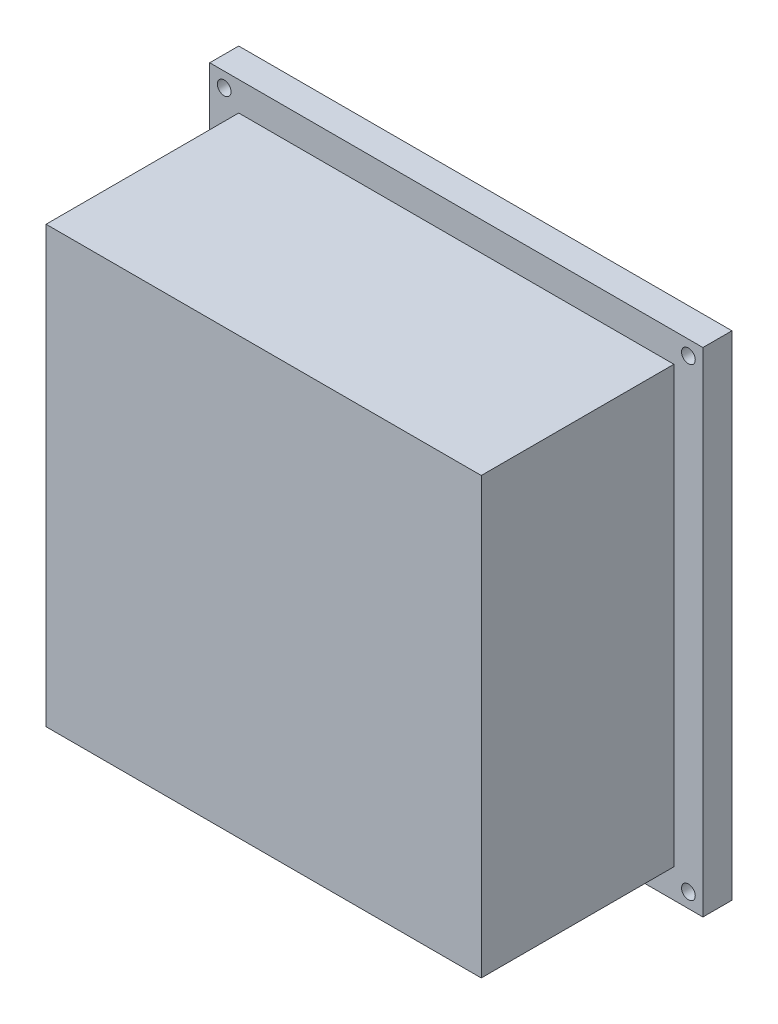
ISO-10303-21;
HEADER;
FILE_DESCRIPTION(('STEP AP214'),'2;1');
FILE_NAME('part.step','',(''),(''),'','','');
FILE_SCHEMA(('AUTOMOTIVE_DESIGN { 1 0 10303 214 1 1 1 1 }'));
ENDSEC;
DATA;
#1=APPLICATION_CONTEXT('core data for automotive mechanical design processes');
#2=APPLICATION_PROTOCOL_DEFINITION('international standard','automotive_design',2000,#1);
#3=PRODUCT_CONTEXT('',#1,'mechanical');
#4=PRODUCT('Part','Part','',(#3));
#5=PRODUCT_RELATED_PRODUCT_CATEGORY('part','',(#4));
#6=PRODUCT_DEFINITION_FORMATION('','',#4);
#7=PRODUCT_DEFINITION_CONTEXT('part definition',#1,'design');
#8=PRODUCT_DEFINITION('design','',#6,#7);
#9=PRODUCT_DEFINITION_SHAPE('','',#8);
#10=(LENGTH_UNIT() NAMED_UNIT(*) SI_UNIT(.MILLI.,.METRE.));
#11=(NAMED_UNIT(*) PLANE_ANGLE_UNIT() SI_UNIT($,.RADIAN.));
#12=(NAMED_UNIT(*) SI_UNIT($,.STERADIAN.) SOLID_ANGLE_UNIT());
#13=UNCERTAINTY_MEASURE_WITH_UNIT(LENGTH_MEASURE(1.E-05),#10,'distance_accuracy_value','');
#14=(GEOMETRIC_REPRESENTATION_CONTEXT(3) GLOBAL_UNCERTAINTY_ASSIGNED_CONTEXT((#13)) GLOBAL_UNIT_ASSIGNED_CONTEXT((#10,
#11,#12)) REPRESENTATION_CONTEXT('',''));
#15=CARTESIAN_POINT('',(0.,0.,0.));
#16=DIRECTION('',(0.,0.,1.));
#17=DIRECTION('',(1.,0.,0.));
#18=AXIS2_PLACEMENT_3D('',#15,#16,#17);
#19=CARTESIAN_POINT('',(0.,44.45,42.164));
#20=DIRECTION('',(0.,1.,0.));
#21=DIRECTION('',(0.,0.,1.));
#22=AXIS2_PLACEMENT_3D('',#19,#20,#21);
#23=PLANE('',#22);
#24=DIRECTION('',(1.,0.,0.));
#25=VECTOR('',#24,1.);
#26=CARTESIAN_POINT('',(0.,44.45,0.));
#27=LINE('',#26,#25);
#28=CARTESIAN_POINT('',(-44.45,44.45,0.));
#29=VERTEX_POINT('',#28);
#30=CARTESIAN_POINT('',(44.45,44.45,0.));
#31=VERTEX_POINT('',#30);
#32=EDGE_CURVE('E101',#29,#31,#27,.T.);
#33=ORIENTED_EDGE('',*,*,#32,.T.);
#34=DIRECTION('',(0.,0.,-1.));
#35=VECTOR('',#34,1.);
#36=CARTESIAN_POINT('',(44.45,44.45,42.164));
#37=LINE('',#36,#35);
#38=CARTESIAN_POINT('',(44.45,44.45,42.164));
#39=VERTEX_POINT('',#38);
#40=EDGE_CURVE('E11',#39,#31,#37,.T.);
#41=ORIENTED_EDGE('',*,*,#40,.F.);
#42=DIRECTION('',(1.,0.,0.));
#43=VECTOR('',#42,1.);
#44=CARTESIAN_POINT('',(0.,44.45,42.164));
#45=LINE('',#44,#43);
#46=CARTESIAN_POINT('',(-44.45,44.45,42.164));
#47=VERTEX_POINT('',#46);
#48=EDGE_CURVE('E102',#47,#39,#45,.T.);
#49=ORIENTED_EDGE('',*,*,#48,.F.);
#50=DIRECTION('',(0.,0.,-1.));
#51=VECTOR('',#50,1.);
#52=CARTESIAN_POINT('',(-44.45,44.45,42.164));
#53=LINE('',#52,#51);
#54=EDGE_CURVE('E87',#47,#29,#53,.T.);
#55=ORIENTED_EDGE('',*,*,#54,.T.);
#56=EDGE_LOOP('',(#33,#41,#49,#55));
#57=FACE_BOUND('',#56,.T.);
#58=ADVANCED_FACE('F35',(#57),#23,.F.);
#59=CARTESIAN_POINT('',(44.45,0.,42.164));
#60=DIRECTION('',(1.,0.,0.));
#61=DIRECTION('',(0.,0.,-1.));
#62=AXIS2_PLACEMENT_3D('',#59,#60,#61);
#63=PLANE('',#62);
#64=DIRECTION('',(0.,-1.,0.));
#65=VECTOR('',#64,1.);
#66=CARTESIAN_POINT('',(44.45,0.,0.));
#67=LINE('',#66,#65);
#68=CARTESIAN_POINT('',(44.45,-44.45,0.));
#69=VERTEX_POINT('',#68);
#70=EDGE_CURVE('E95',#31,#69,#67,.T.);
#71=ORIENTED_EDGE('',*,*,#70,.T.);
#72=DIRECTION('',(0.,0.,-1.));
#73=VECTOR('',#72,1.);
#74=CARTESIAN_POINT('',(44.45,-44.45,42.164));
#75=LINE('',#74,#73);
#76=CARTESIAN_POINT('',(44.45,-44.45,42.164));
#77=VERTEX_POINT('',#76);
#78=EDGE_CURVE('E44',#77,#69,#75,.T.);
#79=ORIENTED_EDGE('',*,*,#78,.F.);
#80=DIRECTION('',(0.,-1.,0.));
#81=VECTOR('',#80,1.);
#82=CARTESIAN_POINT('',(44.45,0.,42.164));
#83=LINE('',#82,#81);
#84=EDGE_CURVE('E105',#39,#77,#83,.T.);
#85=ORIENTED_EDGE('',*,*,#84,.F.);
#86=ORIENTED_EDGE('',*,*,#40,.T.);
#87=EDGE_LOOP('',(#71,#79,#85,#86));
#88=FACE_BOUND('',#87,.T.);
#89=ADVANCED_FACE('F226',(#88),#63,.F.);
#90=CARTESIAN_POINT('',(0.,-44.45,42.164));
#91=DIRECTION('',(0.,1.,0.));
#92=DIRECTION('',(0.,0.,1.));
#93=AXIS2_PLACEMENT_3D('',#90,#91,#92);
#94=PLANE('',#93);
#95=DIRECTION('',(1.,0.,0.));
#96=VECTOR('',#95,1.);
#97=CARTESIAN_POINT('',(0.,-44.45,0.));
#98=LINE('',#97,#96);
#99=CARTESIAN_POINT('',(-44.45,-44.45,0.));
#100=VERTEX_POINT('',#99);
#101=EDGE_CURVE('E90',#100,#69,#98,.T.);
#102=ORIENTED_EDGE('',*,*,#101,.F.);
#103=DIRECTION('',(0.,0.,-1.));
#104=VECTOR('',#103,1.);
#105=CARTESIAN_POINT('',(-44.45,-44.45,42.164));
#106=LINE('',#105,#104);
#107=CARTESIAN_POINT('',(-44.45,-44.45,42.164));
#108=VERTEX_POINT('',#107);
#109=EDGE_CURVE('E79',#108,#100,#106,.T.);
#110=ORIENTED_EDGE('',*,*,#109,.F.);
#111=DIRECTION('',(1.,0.,0.));
#112=VECTOR('',#111,1.);
#113=CARTESIAN_POINT('',(0.,-44.45,42.164));
#114=LINE('',#113,#112);
#115=EDGE_CURVE('E61',#108,#77,#114,.T.);
#116=ORIENTED_EDGE('',*,*,#115,.T.);
#117=ORIENTED_EDGE('',*,*,#78,.T.);
#118=EDGE_LOOP('',(#102,#110,#116,#117));
#119=FACE_BOUND('',#118,.T.);
#120=ADVANCED_FACE('F91',(#119),#94,.T.);
#121=CARTESIAN_POINT('',(47.625,0.,42.164));
#122=DIRECTION('',(1.,0.,0.));
#123=DIRECTION('',(0.,0.,-1.));
#124=AXIS2_PLACEMENT_3D('',#121,#122,#123);
#125=PLANE('',#124);
#126=DIRECTION('',(0.,1.,0.));
#127=VECTOR('',#126,1.);
#128=CARTESIAN_POINT('',(47.625,47.625,6.34999999999999));
#129=LINE('',#128,#127);
#130=CARTESIAN_POINT('',(47.625,-47.625,6.34999999999999));
#131=VERTEX_POINT('',#130);
#132=CARTESIAN_POINT('',(47.625,47.625,6.34999999999999));
#133=VERTEX_POINT('',#132);
#134=EDGE_CURVE('E52',#131,#133,#129,.T.);
#135=ORIENTED_EDGE('',*,*,#134,.T.);
#136=DIRECTION('',(0.,0.,-1.));
#137=VECTOR('',#136,1.);
#138=CARTESIAN_POINT('',(47.625,47.625,42.164));
#139=LINE('',#138,#137);
#140=CARTESIAN_POINT('',(47.625,47.625,48.514));
#141=VERTEX_POINT('',#140);
#142=EDGE_CURVE('E39',#141,#133,#139,.T.);
#143=ORIENTED_EDGE('',*,*,#142,.F.);
#144=DIRECTION('',(0.,1.,0.));
#145=VECTOR('',#144,1.);
#146=CARTESIAN_POINT('',(47.625,47.625,48.514));
#147=LINE('',#146,#145);
#148=CARTESIAN_POINT('',(47.625,-47.625,48.514));
#149=VERTEX_POINT('',#148);
#150=EDGE_CURVE('E140',#149,#141,#147,.T.);
#151=ORIENTED_EDGE('',*,*,#150,.F.);
#152=DIRECTION('',(0.,0.,-1.));
#153=VECTOR('',#152,1.);
#154=CARTESIAN_POINT('',(47.625,-47.625,42.164));
#155=LINE('',#154,#153);
#156=EDGE_CURVE('E111',#149,#131,#155,.T.);
#157=ORIENTED_EDGE('',*,*,#156,.T.);
#158=EDGE_LOOP('',(#135,#143,#151,#157));
#159=FACE_BOUND('',#158,.T.);
#160=ADVANCED_FACE('F37',(#159),#125,.T.);
#161=CARTESIAN_POINT('',(0.,47.625,42.164));
#162=DIRECTION('',(0.,1.,0.));
#163=DIRECTION('',(-1.,0.,0.));
#164=AXIS2_PLACEMENT_3D('',#161,#162,#163);
#165=PLANE('',#164);
#166=DIRECTION('',(-1.,0.,0.));
#167=VECTOR('',#166,1.);
#168=CARTESIAN_POINT('',(-47.625,47.625,6.34999999999999));
#169=LINE('',#168,#167);
#170=CARTESIAN_POINT('',(-47.625,47.625,6.34999999999999));
#171=VERTEX_POINT('',#170);
#172=EDGE_CURVE('E130',#133,#171,#169,.T.);
#173=ORIENTED_EDGE('',*,*,#172,.T.);
#174=DIRECTION('',(0.,0.,-1.));
#175=VECTOR('',#174,1.);
#176=CARTESIAN_POINT('',(-47.625,47.625,42.164));
#177=LINE('',#176,#175);
#178=CARTESIAN_POINT('',(-47.625,47.625,48.514));
#179=VERTEX_POINT('',#178);
#180=EDGE_CURVE('E116',#179,#171,#177,.T.);
#181=ORIENTED_EDGE('',*,*,#180,.F.);
#182=DIRECTION('',(-1.,0.,0.));
#183=VECTOR('',#182,1.);
#184=CARTESIAN_POINT('',(-47.625,47.625,48.514));
#185=LINE('',#184,#183);
#186=EDGE_CURVE('E133',#141,#179,#185,.T.);
#187=ORIENTED_EDGE('',*,*,#186,.F.);
#188=ORIENTED_EDGE('',*,*,#142,.T.);
#189=EDGE_LOOP('',(#173,#181,#187,#188));
#190=FACE_BOUND('',#189,.T.);
#191=ADVANCED_FACE('F129',(#190),#165,.T.);
#192=CARTESIAN_POINT('',(-47.625,0.,42.164));
#193=DIRECTION('',(1.,0.,0.));
#194=DIRECTION('',(0.,1.,0.));
#195=AXIS2_PLACEMENT_3D('',#192,#193,#194);
#196=PLANE('',#195);
#197=ORIENTED_EDGE('',*,*,#180,.T.);
#198=DIRECTION('',(0.,-1.,0.));
#199=VECTOR('',#198,1.);
#200=CARTESIAN_POINT('',(-47.625,47.625,6.34999999999999));
#201=LINE('',#200,#199);
#202=CARTESIAN_POINT('',(-47.625,-47.625,6.34999999999999));
#203=VERTEX_POINT('',#202);
#204=EDGE_CURVE('E210',#171,#203,#201,.T.);
#205=ORIENTED_EDGE('',*,*,#204,.T.);
#206=DIRECTION('',(0.,0.,-1.));
#207=VECTOR('',#206,1.);
#208=CARTESIAN_POINT('',(-47.625,-47.625,42.164));
#209=LINE('',#208,#207);
#210=CARTESIAN_POINT('',(-47.625,-47.625,48.514));
#211=VERTEX_POINT('',#210);
#212=EDGE_CURVE('E114',#211,#203,#209,.T.);
#213=ORIENTED_EDGE('',*,*,#212,.F.);
#214=DIRECTION('',(0.,-1.,0.));
#215=VECTOR('',#214,1.);
#216=CARTESIAN_POINT('',(-47.625,47.625,48.514));
#217=LINE('',#216,#215);
#218=EDGE_CURVE('E348',#179,#211,#217,.T.);
#219=ORIENTED_EDGE('',*,*,#218,.F.);
#220=EDGE_LOOP('',(#197,#205,#213,#219));
#221=FACE_BOUND('',#220,.T.);
#222=ADVANCED_FACE('F256',(#221),#196,.F.);
#223=CARTESIAN_POINT('',(0.,-47.625,42.164));
#224=DIRECTION('',(0.,1.,0.));
#225=DIRECTION('',(0.,0.,1.));
#226=AXIS2_PLACEMENT_3D('',#223,#224,#225);
#227=PLANE('',#226);
#228=ORIENTED_EDGE('',*,*,#212,.T.);
#229=DIRECTION('',(1.,0.,0.));
#230=VECTOR('',#229,1.);
#231=CARTESIAN_POINT('',(-47.625,-47.625,6.34999999999999));
#232=LINE('',#231,#230);
#233=EDGE_CURVE('E207',#203,#131,#232,.T.);
#234=ORIENTED_EDGE('',*,*,#233,.T.);
#235=ORIENTED_EDGE('',*,*,#156,.F.);
#236=DIRECTION('',(1.,0.,0.));
#237=VECTOR('',#236,1.);
#238=CARTESIAN_POINT('',(-47.625,-47.625,48.514));
#239=LINE('',#238,#237);
#240=EDGE_CURVE('E346',#211,#149,#239,.T.);
#241=ORIENTED_EDGE('',*,*,#240,.F.);
#242=EDGE_LOOP('',(#228,#234,#235,#241));
#243=FACE_BOUND('',#242,.T.);
#244=ADVANCED_FACE('F253',(#243),#227,.F.);
#245=CARTESIAN_POINT('',(-44.45,0.,42.164));
#246=DIRECTION('',(1.,0.,0.));
#247=DIRECTION('',(0.,0.,-1.));
#248=AXIS2_PLACEMENT_3D('',#245,#246,#247);
#249=PLANE('',#248);
#250=DIRECTION('',(0.,-1.,0.));
#251=VECTOR('',#250,1.);
#252=CARTESIAN_POINT('',(-44.45,0.,0.));
#253=LINE('',#252,#251);
#254=EDGE_CURVE('E84',#29,#100,#253,.T.);
#255=ORIENTED_EDGE('',*,*,#254,.F.);
#256=ORIENTED_EDGE('',*,*,#54,.F.);
#257=DIRECTION('',(0.,-1.,0.));
#258=VECTOR('',#257,1.);
#259=CARTESIAN_POINT('',(-44.45,0.,42.164));
#260=LINE('',#259,#258);
#261=EDGE_CURVE('E85',#47,#108,#260,.T.);
#262=ORIENTED_EDGE('',*,*,#261,.T.);
#263=ORIENTED_EDGE('',*,*,#109,.T.);
#264=EDGE_LOOP('',(#255,#256,#262,#263));
#265=FACE_BOUND('',#264,.T.);
#266=ADVANCED_FACE('F81',(#265),#249,.T.);
#267=CARTESIAN_POINT('',(0.,0.,0.));
#268=DIRECTION('',(0.,0.,1.));
#269=DIRECTION('',(1.,0.,0.));
#270=AXIS2_PLACEMENT_3D('',#267,#268,#269);
#271=PLANE('',#270);
#272=ORIENTED_EDGE('',*,*,#32,.F.);
#273=ORIENTED_EDGE('',*,*,#254,.T.);
#274=ORIENTED_EDGE('',*,*,#101,.T.);
#275=ORIENTED_EDGE('',*,*,#70,.F.);
#276=EDGE_LOOP('',(#272,#273,#274,#275));
#277=FACE_BOUND('',#276,.T.);
#278=DIRECTION('',(0.,1.,0.));
#279=VECTOR('',#278,1.);
#280=CARTESIAN_POINT('',(53.975,53.975,0.));
#281=LINE('',#280,#279);
#282=CARTESIAN_POINT('',(53.975,-53.975,0.));
#283=VERTEX_POINT('',#282);
#284=CARTESIAN_POINT('',(53.975,53.975,0.));
#285=VERTEX_POINT('',#284);
#286=EDGE_CURVE('E200',#283,#285,#281,.T.);
#287=ORIENTED_EDGE('',*,*,#286,.F.);
#288=DIRECTION('',(1.,0.,0.));
#289=VECTOR('',#288,1.);
#290=CARTESIAN_POINT('',(-53.975,-53.975,0.));
#291=LINE('',#290,#289);
#292=CARTESIAN_POINT('',(-53.975,-53.975,0.));
#293=VERTEX_POINT('',#292);
#294=EDGE_CURVE('E183',#293,#283,#291,.T.);
#295=ORIENTED_EDGE('',*,*,#294,.F.);
#296=DIRECTION('',(0.,-1.,0.));
#297=VECTOR('',#296,1.);
#298=CARTESIAN_POINT('',(-53.975,53.975,0.));
#299=LINE('',#298,#297);
#300=CARTESIAN_POINT('',(-53.975,53.975,0.));
#301=VERTEX_POINT('',#300);
#302=EDGE_CURVE('E194',#301,#293,#299,.T.);
#303=ORIENTED_EDGE('',*,*,#302,.F.);
#304=DIRECTION('',(-1.,0.,0.));
#305=VECTOR('',#304,1.);
#306=CARTESIAN_POINT('',(-53.975,53.975,0.));
#307=LINE('',#306,#305);
#308=EDGE_CURVE('E205',#285,#301,#307,.T.);
#309=ORIENTED_EDGE('',*,*,#308,.F.);
#310=EDGE_LOOP('',(#287,#295,#303,#309));
#311=FACE_BOUND('',#310,.T.);
#312=CARTESIAN_POINT('',(-50.8,50.8,0.));
#313=DIRECTION('',(0.,0.,1.));
#314=DIRECTION('',(1.,0.,0.));
#315=AXIS2_PLACEMENT_3D('',#312,#313,#314);
#316=CIRCLE('',#315,1.5);
#317=CARTESIAN_POINT('',(-49.3,50.8,0.));
#318=VERTEX_POINT('',#317);
#319=EDGE_CURVE('E321',#318,#318,#316,.T.);
#320=ORIENTED_EDGE('',*,*,#319,.T.);
#321=EDGE_LOOP('',(#320));
#322=FACE_BOUND('',#321,.T.);
#323=CARTESIAN_POINT('',(50.8,50.8,0.));
#324=DIRECTION('',(0.,0.,1.));
#325=DIRECTION('',(1.,0.,0.));
#326=AXIS2_PLACEMENT_3D('',#323,#324,#325);
#327=CIRCLE('',#326,1.5);
#328=CARTESIAN_POINT('',(52.3,50.8,0.));
#329=VERTEX_POINT('',#328);
#330=EDGE_CURVE('E311',#329,#329,#327,.T.);
#331=ORIENTED_EDGE('',*,*,#330,.T.);
#332=EDGE_LOOP('',(#331));
#333=FACE_BOUND('',#332,.T.);
#334=CARTESIAN_POINT('',(-50.8,-50.8,0.));
#335=DIRECTION('',(0.,0.,1.));
#336=DIRECTION('',(1.,0.,0.));
#337=AXIS2_PLACEMENT_3D('',#334,#335,#336);
#338=CIRCLE('',#337,1.50000000000001);
#339=CARTESIAN_POINT('',(-49.3,-50.8,0.));
#340=VERTEX_POINT('',#339);
#341=EDGE_CURVE('E307',#340,#340,#338,.T.);
#342=ORIENTED_EDGE('',*,*,#341,.T.);
#343=EDGE_LOOP('',(#342));
#344=FACE_BOUND('',#343,.T.);
#345=CARTESIAN_POINT('',(50.8,-50.8,0.));
#346=DIRECTION('',(0.,0.,1.));
#347=DIRECTION('',(1.,0.,0.));
#348=AXIS2_PLACEMENT_3D('',#345,#346,#347);
#349=CIRCLE('',#348,1.49999999999999);
#350=CARTESIAN_POINT('',(52.3,-50.8,0.));
#351=VERTEX_POINT('',#350);
#352=EDGE_CURVE('E314',#351,#351,#349,.T.);
#353=ORIENTED_EDGE('',*,*,#352,.T.);
#354=EDGE_LOOP('',(#353));
#355=FACE_BOUND('',#354,.T.);
#356=ADVANCED_FACE('F98',(#277,#311,#322,#333,#344,#355),#271,.F.);
#357=CARTESIAN_POINT('',(0.,0.,6.34999999999999));
#358=DIRECTION('',(0.,0.,1.));
#359=DIRECTION('',(1.,0.,0.));
#360=AXIS2_PLACEMENT_3D('',#357,#358,#359);
#361=PLANE('',#360);
#362=CARTESIAN_POINT('',(-50.8,-50.8,6.34999999999999));
#363=DIRECTION('',(0.,0.,1.));
#364=DIRECTION('',(1.,0.,0.));
#365=AXIS2_PLACEMENT_3D('',#362,#363,#364);
#366=CIRCLE('',#365,1.50000000000001);
#367=CARTESIAN_POINT('',(-49.3,-50.8,6.34999999999999));
#368=VERTEX_POINT('',#367);
#369=EDGE_CURVE('E304',#368,#368,#366,.T.);
#370=ORIENTED_EDGE('',*,*,#369,.F.);
#371=EDGE_LOOP('',(#370));
#372=FACE_BOUND('',#371,.T.);
#373=CARTESIAN_POINT('',(-50.8,50.8,6.34999999999999));
#374=DIRECTION('',(0.,0.,1.));
#375=DIRECTION('',(1.,0.,0.));
#376=AXIS2_PLACEMENT_3D('',#373,#374,#375);
#377=CIRCLE('',#376,1.5);
#378=CARTESIAN_POINT('',(-49.3,50.8,6.34999999999999));
#379=VERTEX_POINT('',#378);
#380=EDGE_CURVE('E324',#379,#379,#377,.T.);
#381=ORIENTED_EDGE('',*,*,#380,.F.);
#382=EDGE_LOOP('',(#381));
#383=FACE_BOUND('',#382,.T.);
#384=DIRECTION('',(0.,1.,0.));
#385=VECTOR('',#384,1.);
#386=CARTESIAN_POINT('',(53.975,53.975,6.34999999999999));
#387=LINE('',#386,#385);
#388=CARTESIAN_POINT('',(53.975,-53.975,6.34999999999999));
#389=VERTEX_POINT('',#388);
#390=CARTESIAN_POINT('',(53.975,53.975,6.34999999999999));
#391=VERTEX_POINT('',#390);
#392=EDGE_CURVE('E193',#389,#391,#387,.T.);
#393=ORIENTED_EDGE('',*,*,#392,.T.);
#394=DIRECTION('',(-1.,0.,0.));
#395=VECTOR('',#394,1.);
#396=CARTESIAN_POINT('',(-53.975,53.975,6.34999999999999));
#397=LINE('',#396,#395);
#398=CARTESIAN_POINT('',(-53.975,53.975,6.34999999999999));
#399=VERTEX_POINT('',#398);
#400=EDGE_CURVE('E333',#391,#399,#397,.T.);
#401=ORIENTED_EDGE('',*,*,#400,.T.);
#402=DIRECTION('',(0.,-1.,0.));
#403=VECTOR('',#402,1.);
#404=CARTESIAN_POINT('',(-53.975,53.975,6.34999999999999));
#405=LINE('',#404,#403);
#406=CARTESIAN_POINT('',(-53.975,-53.975,6.34999999999999));
#407=VERTEX_POINT('',#406);
#408=EDGE_CURVE('E334',#399,#407,#405,.T.);
#409=ORIENTED_EDGE('',*,*,#408,.T.);
#410=DIRECTION('',(1.,0.,0.));
#411=VECTOR('',#410,1.);
#412=CARTESIAN_POINT('',(-53.975,-53.975,6.34999999999999));
#413=LINE('',#412,#411);
#414=EDGE_CURVE('E202',#407,#389,#413,.T.);
#415=ORIENTED_EDGE('',*,*,#414,.T.);
#416=EDGE_LOOP('',(#393,#401,#409,#415));
#417=FACE_BOUND('',#416,.T.);
#418=ORIENTED_EDGE('',*,*,#172,.F.);
#419=ORIENTED_EDGE('',*,*,#134,.F.);
#420=ORIENTED_EDGE('',*,*,#233,.F.);
#421=ORIENTED_EDGE('',*,*,#204,.F.);
#422=EDGE_LOOP('',(#418,#419,#420,#421));
#423=FACE_BOUND('',#422,.T.);
#424=CARTESIAN_POINT('',(50.8,50.8,6.34999999999999));
#425=DIRECTION('',(0.,0.,1.));
#426=DIRECTION('',(1.,0.,0.));
#427=AXIS2_PLACEMENT_3D('',#424,#425,#426);
#428=CIRCLE('',#427,1.5);
#429=CARTESIAN_POINT('',(52.3,50.8,6.34999999999999));
#430=VERTEX_POINT('',#429);
#431=EDGE_CURVE('E318',#430,#430,#428,.T.);
#432=ORIENTED_EDGE('',*,*,#431,.F.);
#433=EDGE_LOOP('',(#432));
#434=FACE_BOUND('',#433,.T.);
#435=CARTESIAN_POINT('',(50.8,-50.8,6.34999999999999));
#436=DIRECTION('',(0.,0.,1.));
#437=DIRECTION('',(1.,0.,0.));
#438=AXIS2_PLACEMENT_3D('',#435,#436,#437);
#439=CIRCLE('',#438,1.49999999999999);
#440=CARTESIAN_POINT('',(52.3,-50.8,6.34999999999999));
#441=VERTEX_POINT('',#440);
#442=EDGE_CURVE('E309',#441,#441,#439,.T.);
#443=ORIENTED_EDGE('',*,*,#442,.F.);
#444=EDGE_LOOP('',(#443));
#445=FACE_BOUND('',#444,.T.);
#446=ADVANCED_FACE('F273',(#372,#383,#417,#423,#434,#445),#361,.T.);
#447=CARTESIAN_POINT('',(53.975,53.975,6.34999999999999));
#448=DIRECTION('',(-1.,0.,0.));
#449=DIRECTION('',(0.,0.,1.));
#450=AXIS2_PLACEMENT_3D('',#447,#448,#449);
#451=PLANE('',#450);
#452=ORIENTED_EDGE('',*,*,#286,.T.);
#453=DIRECTION('',(0.,0.,-1.));
#454=VECTOR('',#453,1.);
#455=CARTESIAN_POINT('',(53.975,53.975,6.34999999999999));
#456=LINE('',#455,#454);
#457=EDGE_CURVE('E220',#391,#285,#456,.T.);
#458=ORIENTED_EDGE('',*,*,#457,.F.);
#459=ORIENTED_EDGE('',*,*,#392,.F.);
#460=DIRECTION('',(0.,0.,-1.));
#461=VECTOR('',#460,1.);
#462=CARTESIAN_POINT('',(53.975,-53.975,6.34999999999999));
#463=LINE('',#462,#461);
#464=EDGE_CURVE('E187',#389,#283,#463,.T.);
#465=ORIENTED_EDGE('',*,*,#464,.T.);
#466=EDGE_LOOP('',(#452,#458,#459,#465));
#467=FACE_BOUND('',#466,.T.);
#468=ADVANCED_FACE('F198',(#467),#451,.F.);
#469=CARTESIAN_POINT('',(-53.975,53.975,6.34999999999999));
#470=DIRECTION('',(0.,-1.,0.));
#471=DIRECTION('',(0.,0.,-1.));
#472=AXIS2_PLACEMENT_3D('',#469,#470,#471);
#473=PLANE('',#472);
#474=ORIENTED_EDGE('',*,*,#308,.T.);
#475=DIRECTION('',(0.,0.,-1.));
#476=VECTOR('',#475,1.);
#477=CARTESIAN_POINT('',(-53.975,53.975,6.34999999999999));
#478=LINE('',#477,#476);
#479=EDGE_CURVE('E217',#399,#301,#478,.T.);
#480=ORIENTED_EDGE('',*,*,#479,.F.);
#481=ORIENTED_EDGE('',*,*,#400,.F.);
#482=ORIENTED_EDGE('',*,*,#457,.T.);
#483=EDGE_LOOP('',(#474,#480,#481,#482));
#484=FACE_BOUND('',#483,.T.);
#485=ADVANCED_FACE('F276',(#484),#473,.F.);
#486=CARTESIAN_POINT('',(-53.975,53.975,6.34999999999999));
#487=DIRECTION('',(1.,0.,0.));
#488=DIRECTION('',(0.,0.,-1.));
#489=AXIS2_PLACEMENT_3D('',#486,#487,#488);
#490=PLANE('',#489);
#491=ORIENTED_EDGE('',*,*,#302,.T.);
#492=DIRECTION('',(0.,0.,-1.));
#493=VECTOR('',#492,1.);
#494=CARTESIAN_POINT('',(-53.975,-53.975,6.34999999999999));
#495=LINE('',#494,#493);
#496=EDGE_CURVE('E190',#407,#293,#495,.T.);
#497=ORIENTED_EDGE('',*,*,#496,.F.);
#498=ORIENTED_EDGE('',*,*,#408,.F.);
#499=ORIENTED_EDGE('',*,*,#479,.T.);
#500=EDGE_LOOP('',(#491,#497,#498,#499));
#501=FACE_BOUND('',#500,.T.);
#502=ADVANCED_FACE('F279',(#501),#490,.F.);
#503=CARTESIAN_POINT('',(-53.975,-53.975,6.34999999999999));
#504=DIRECTION('',(0.,1.,0.));
#505=DIRECTION('',(0.,0.,1.));
#506=AXIS2_PLACEMENT_3D('',#503,#504,#505);
#507=PLANE('',#506);
#508=ORIENTED_EDGE('',*,*,#294,.T.);
#509=ORIENTED_EDGE('',*,*,#464,.F.);
#510=ORIENTED_EDGE('',*,*,#414,.F.);
#511=ORIENTED_EDGE('',*,*,#496,.T.);
#512=EDGE_LOOP('',(#508,#509,#510,#511));
#513=FACE_BOUND('',#512,.T.);
#514=ADVANCED_FACE('F185',(#513),#507,.F.);
#515=CARTESIAN_POINT('',(-50.8,50.8,6.34999999999999));
#516=DIRECTION('',(0.,0.,-1.));
#517=DIRECTION('',(-1.,0.,0.));
#518=AXIS2_PLACEMENT_3D('',#515,#516,#517);
#519=CYLINDRICAL_SURFACE('',#518,1.5);
#520=ORIENTED_EDGE('',*,*,#380,.T.);
#521=EDGE_LOOP('',(#520));
#522=FACE_BOUND('',#521,.T.);
#523=ORIENTED_EDGE('',*,*,#319,.F.);
#524=EDGE_LOOP('',(#523));
#525=FACE_BOUND('',#524,.T.);
#526=ADVANCED_FACE('F286',(#522,#525),#519,.F.);
#527=CARTESIAN_POINT('',(50.8,50.8,6.34999999999999));
#528=DIRECTION('',(0.,0.,-1.));
#529=DIRECTION('',(-1.,0.,0.));
#530=AXIS2_PLACEMENT_3D('',#527,#528,#529);
#531=CYLINDRICAL_SURFACE('',#530,1.5);
#532=ORIENTED_EDGE('',*,*,#431,.T.);
#533=EDGE_LOOP('',(#532));
#534=FACE_BOUND('',#533,.T.);
#535=ORIENTED_EDGE('',*,*,#330,.F.);
#536=EDGE_LOOP('',(#535));
#537=FACE_BOUND('',#536,.T.);
#538=ADVANCED_FACE('F292',(#534,#537),#531,.F.);
#539=CARTESIAN_POINT('',(-50.8,-50.8,6.34999999999999));
#540=DIRECTION('',(0.,0.,-1.));
#541=DIRECTION('',(-1.,0.,0.));
#542=AXIS2_PLACEMENT_3D('',#539,#540,#541);
#543=CYLINDRICAL_SURFACE('',#542,1.50000000000001);
#544=ORIENTED_EDGE('',*,*,#369,.T.);
#545=EDGE_LOOP('',(#544));
#546=FACE_BOUND('',#545,.T.);
#547=ORIENTED_EDGE('',*,*,#341,.F.);
#548=EDGE_LOOP('',(#547));
#549=FACE_BOUND('',#548,.T.);
#550=ADVANCED_FACE('F242',(#546,#549),#543,.F.);
#551=CARTESIAN_POINT('',(50.8,-50.8,6.34999999999999));
#552=DIRECTION('',(0.,0.,-1.));
#553=DIRECTION('',(-1.,0.,0.));
#554=AXIS2_PLACEMENT_3D('',#551,#552,#553);
#555=CYLINDRICAL_SURFACE('',#554,1.49999999999999);
#556=ORIENTED_EDGE('',*,*,#442,.T.);
#557=EDGE_LOOP('',(#556));
#558=FACE_BOUND('',#557,.T.);
#559=ORIENTED_EDGE('',*,*,#352,.F.);
#560=EDGE_LOOP('',(#559));
#561=FACE_BOUND('',#560,.T.);
#562=ADVANCED_FACE('F234',(#558,#561),#555,.F.);
#563=CARTESIAN_POINT('',(0.,0.,42.164));
#564=DIRECTION('',(0.,0.,1.));
#565=DIRECTION('',(1.,0.,0.));
#566=AXIS2_PLACEMENT_3D('',#563,#564,#565);
#567=PLANE('',#566);
#568=ORIENTED_EDGE('',*,*,#261,.F.);
#569=ORIENTED_EDGE('',*,*,#48,.T.);
#570=ORIENTED_EDGE('',*,*,#84,.T.);
#571=ORIENTED_EDGE('',*,*,#115,.F.);
#572=EDGE_LOOP('',(#568,#569,#570,#571));
#573=FACE_BOUND('',#572,.T.);
#574=ADVANCED_FACE('F231',(#573),#567,.F.);
#575=CARTESIAN_POINT('',(0.,0.,48.514));
#576=DIRECTION('',(0.,0.,1.));
#577=DIRECTION('',(1.,0.,0.));
#578=AXIS2_PLACEMENT_3D('',#575,#576,#577);
#579=PLANE('',#578);
#580=ORIENTED_EDGE('',*,*,#150,.T.);
#581=ORIENTED_EDGE('',*,*,#186,.T.);
#582=ORIENTED_EDGE('',*,*,#218,.T.);
#583=ORIENTED_EDGE('',*,*,#240,.T.);
#584=EDGE_LOOP('',(#580,#581,#582,#583));
#585=FACE_BOUND('',#584,.T.);
#586=ADVANCED_FACE('F233',(#585),#579,.T.);
#587=CLOSED_SHELL('',(#58,#89,#120,#160,#191,#222,#244,#266,#356,#446,#468,#485,#502,#514,#526,
#538,#550,#562,#574,#586));
#588=MANIFOLD_SOLID_BREP('B2',#587);
#589=ADVANCED_BREP_SHAPE_REPRESENTATION('',(#18,#588),#14);
#590=SHAPE_DEFINITION_REPRESENTATION(#9,#589);
ENDSEC;
END-ISO-10303-21;
